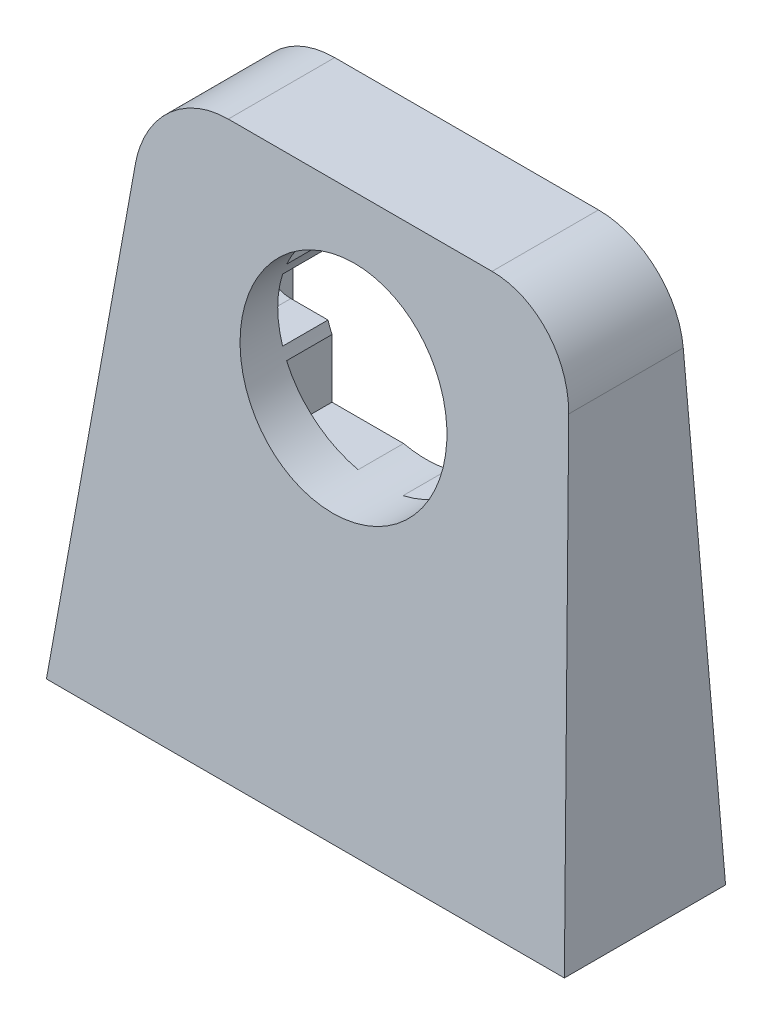
ISO-10303-21;
HEADER;
FILE_DESCRIPTION(('STEP AP214'),'2;1');
FILE_NAME('part.step','',(''),(''),'','','');
FILE_SCHEMA(('AUTOMOTIVE_DESIGN { 1 0 10303 214 1 1 1 1 }'));
ENDSEC;
DATA;
#1=APPLICATION_CONTEXT('core data for automotive mechanical design processes');
#2=APPLICATION_PROTOCOL_DEFINITION('international standard','automotive_design',2000,#1);
#3=PRODUCT_CONTEXT('',#1,'mechanical');
#4=PRODUCT('Part','Part','',(#3));
#5=PRODUCT_RELATED_PRODUCT_CATEGORY('part','',(#4));
#6=PRODUCT_DEFINITION_FORMATION('','',#4);
#7=PRODUCT_DEFINITION_CONTEXT('part definition',#1,'design');
#8=PRODUCT_DEFINITION('design','',#6,#7);
#9=PRODUCT_DEFINITION_SHAPE('','',#8);
#10=(LENGTH_UNIT() NAMED_UNIT(*) SI_UNIT(.MILLI.,.METRE.));
#11=(NAMED_UNIT(*) PLANE_ANGLE_UNIT() SI_UNIT($,.RADIAN.));
#12=(NAMED_UNIT(*) SI_UNIT($,.STERADIAN.) SOLID_ANGLE_UNIT());
#13=UNCERTAINTY_MEASURE_WITH_UNIT(LENGTH_MEASURE(1.E-05),#10,'distance_accuracy_value','');
#14=(GEOMETRIC_REPRESENTATION_CONTEXT(3) GLOBAL_UNCERTAINTY_ASSIGNED_CONTEXT((#13)) GLOBAL_UNIT_ASSIGNED_CONTEXT((#10,
#11,#12)) REPRESENTATION_CONTEXT('',''));
#15=CARTESIAN_POINT('',(0.,0.,0.));
#16=DIRECTION('',(0.,0.,1.));
#17=DIRECTION('',(1.,0.,0.));
#18=AXIS2_PLACEMENT_3D('',#15,#16,#17);
#19=CARTESIAN_POINT('',(0.,15.495,6.06));
#20=DIRECTION('',(0.,-1.,0.));
#21=DIRECTION('',(0.,0.,-1.));
#22=AXIS2_PLACEMENT_3D('',#19,#20,#21);
#23=PLANE('',#22);
#24=DIRECTION('',(0.,0.,-1.));
#25=VECTOR('',#24,1.);
#26=CARTESIAN_POINT('',(-1.5833114033569,15.495,11.3594275189556));
#27=LINE('',#26,#25);
#28=CARTESIAN_POINT('',(-1.5833114033569,15.495,6.06));
#29=VERTEX_POINT('',#28);
#30=CARTESIAN_POINT('',(-1.5833114033569,15.495,2.86));
#31=VERTEX_POINT('',#30);
#32=EDGE_CURVE('E552',#29,#31,#27,.T.);
#33=ORIENTED_EDGE('',*,*,#32,.F.);
#34=DIRECTION('',(-1.,0.,0.));
#35=VECTOR('',#34,1.);
#36=CARTESIAN_POINT('',(0.,15.495,6.06));
#37=LINE('',#36,#35);
#38=CARTESIAN_POINT('',(-6.625,15.495,6.06));
#39=VERTEX_POINT('',#38);
#40=EDGE_CURVE('E268',#29,#39,#37,.T.);
#41=ORIENTED_EDGE('',*,*,#40,.T.);
#42=DIRECTION('',(0.,0.,-1.));
#43=VECTOR('',#42,1.);
#44=CARTESIAN_POINT('',(-6.625,15.495,6.06));
#45=LINE('',#44,#43);
#46=CARTESIAN_POINT('',(-6.625,15.495,2.86));
#47=VERTEX_POINT('',#46);
#48=EDGE_CURVE('E317',#39,#47,#45,.T.);
#49=ORIENTED_EDGE('',*,*,#48,.T.);
#50=DIRECTION('',(-1.,0.,0.));
#51=VECTOR('',#50,1.);
#52=CARTESIAN_POINT('',(0.,15.495,2.86));
#53=LINE('',#52,#51);
#54=EDGE_CURVE('E307',#31,#47,#53,.T.);
#55=ORIENTED_EDGE('',*,*,#54,.F.);
#56=EDGE_LOOP('',(#33,#41,#49,#55));
#57=FACE_BOUND('',#56,.T.);
#58=ADVANCED_FACE('F40',(#57),#23,.T.);
#59=CARTESIAN_POINT('',(0.,1.345,6.06));
#60=DIRECTION('',(0.,-1.,0.));
#61=DIRECTION('',(0.,0.,-1.));
#62=AXIS2_PLACEMENT_3D('',#59,#60,#61);
#63=PLANE('',#62);
#64=DIRECTION('',(-1.,0.,0.));
#65=VECTOR('',#64,1.);
#66=CARTESIAN_POINT('',(0.,1.345,6.06));
#67=LINE('',#66,#65);
#68=CARTESIAN_POINT('',(-1.5833114033569,1.345,6.06));
#69=VERTEX_POINT('',#68);
#70=CARTESIAN_POINT('',(-6.625,1.345,6.06));
#71=VERTEX_POINT('',#70);
#72=EDGE_CURVE('E532',#69,#71,#67,.T.);
#73=ORIENTED_EDGE('',*,*,#72,.F.);
#74=DIRECTION('',(0.,0.,-1.));
#75=VECTOR('',#74,1.);
#76=CARTESIAN_POINT('',(-1.5833114033569,1.345,11.3594275189556));
#77=LINE('',#76,#75);
#78=CARTESIAN_POINT('',(-1.5833114033569,1.345,2.86));
#79=VERTEX_POINT('',#78);
#80=EDGE_CURVE('E556',#69,#79,#77,.T.);
#81=ORIENTED_EDGE('',*,*,#80,.T.);
#82=DIRECTION('',(-1.,0.,0.));
#83=VECTOR('',#82,1.);
#84=CARTESIAN_POINT('',(0.,1.345,2.86));
#85=LINE('',#84,#83);
#86=CARTESIAN_POINT('',(-6.625,1.345,2.86));
#87=VERTEX_POINT('',#86);
#88=EDGE_CURVE('E290',#79,#87,#85,.T.);
#89=ORIENTED_EDGE('',*,*,#88,.T.);
#90=DIRECTION('',(0.,0.,-1.));
#91=VECTOR('',#90,1.);
#92=CARTESIAN_POINT('',(-6.625,1.345,6.06));
#93=LINE('',#92,#91);
#94=EDGE_CURVE('E325',#71,#87,#93,.T.);
#95=ORIENTED_EDGE('',*,*,#94,.F.);
#96=EDGE_LOOP('',(#73,#81,#89,#95));
#97=FACE_BOUND('',#96,.T.);
#98=ADVANCED_FACE('F456',(#97),#63,.F.);
#99=CARTESIAN_POINT('',(0.,0.,6.06));
#100=DIRECTION('',(0.,0.,-1.));
#101=DIRECTION('',(-1.,0.,0.));
#102=AXIS2_PLACEMENT_3D('',#99,#100,#101);
#103=PLANE('',#102);
#104=CARTESIAN_POINT('',(0.,8.42,6.06));
#105=DIRECTION('',(0.,0.,-1.));
#106=DIRECTION('',(-1.,0.,0.));
#107=AXIS2_PLACEMENT_3D('',#104,#105,#106);
#108=CIRCLE('',#107,7.25);
#109=CARTESIAN_POINT('',(-6.625,11.3648047473474,6.06));
#110=VERTEX_POINT('',#109);
#111=EDGE_CURVE('E510',#110,#29,#108,.T.);
#112=ORIENTED_EDGE('',*,*,#111,.F.);
#113=DIRECTION('',(0.,-1.,0.));
#114=VECTOR('',#113,1.);
#115=CARTESIAN_POINT('',(-6.625,0.,6.06));
#116=LINE('',#115,#114);
#117=EDGE_CURVE('E265',#39,#110,#116,.T.);
#118=ORIENTED_EDGE('',*,*,#117,.F.);
#119=ORIENTED_EDGE('',*,*,#40,.F.);
#120=EDGE_LOOP('',(#112,#118,#119));
#121=FACE_BOUND('',#120,.T.);
#122=ADVANCED_FACE('F463',(#121),#103,.T.);
#123=CARTESIAN_POINT('',(1.5833114033569,15.495,6.06));
#124=VERTEX_POINT('',#123);
#125=CARTESIAN_POINT('',(6.625,11.3648047473474,6.06));
#126=VERTEX_POINT('',#125);
#127=EDGE_CURVE('E506',#124,#126,#108,.T.);
#128=ORIENTED_EDGE('',*,*,#127,.F.);
#129=CARTESIAN_POINT('',(6.625,15.495,6.06));
#130=VERTEX_POINT('',#129);
#131=EDGE_CURVE('E275',#130,#124,#37,.T.);
#132=ORIENTED_EDGE('',*,*,#131,.F.);
#133=DIRECTION('',(0.,-1.,0.));
#134=VECTOR('',#133,1.);
#135=CARTESIAN_POINT('',(6.625,0.,6.06));
#136=LINE('',#135,#134);
#137=EDGE_CURVE('E278',#130,#126,#136,.T.);
#138=ORIENTED_EDGE('',*,*,#137,.T.);
#139=EDGE_LOOP('',(#128,#132,#138));
#140=FACE_BOUND('',#139,.T.);
#141=ADVANCED_FACE('F505',(#140),#103,.T.);
#142=CARTESIAN_POINT('',(6.90814736380167,10.62,6.06));
#143=VERTEX_POINT('',#142);
#144=CARTESIAN_POINT('',(6.90814736380167,6.22,6.06));
#145=VERTEX_POINT('',#144);
#146=EDGE_CURVE('E250',#143,#145,#108,.T.);
#147=ORIENTED_EDGE('',*,*,#146,.F.);
#148=DIRECTION('',(1.,0.,0.));
#149=VECTOR('',#148,1.);
#150=CARTESIAN_POINT('',(0.,10.62,6.06));
#151=LINE('',#150,#149);
#152=CARTESIAN_POINT('',(9.525,10.62,6.06));
#153=VERTEX_POINT('',#152);
#154=EDGE_CURVE('E279',#143,#153,#151,.T.);
#155=ORIENTED_EDGE('',*,*,#154,.T.);
#156=CARTESIAN_POINT('',(9.525,8.42,6.06));
#157=DIRECTION('',(0.,0.,-1.));
#158=DIRECTION('',(-1.,0.,0.));
#159=AXIS2_PLACEMENT_3D('',#156,#157,#158);
#160=CIRCLE('',#159,2.2);
#161=CARTESIAN_POINT('',(9.525,6.22,6.06));
#162=VERTEX_POINT('',#161);
#163=EDGE_CURVE('E310',#162,#153,#160,.F.);
#164=ORIENTED_EDGE('',*,*,#163,.F.);
#165=DIRECTION('',(1.,0.,0.));
#166=VECTOR('',#165,1.);
#167=CARTESIAN_POINT('',(0.,6.22,6.06));
#168=LINE('',#167,#166);
#169=EDGE_CURVE('E528',#145,#162,#168,.T.);
#170=ORIENTED_EDGE('',*,*,#169,.F.);
#171=EDGE_LOOP('',(#147,#155,#164,#170));
#172=FACE_BOUND('',#171,.T.);
#173=ADVANCED_FACE('F565',(#172),#103,.T.);
#174=CARTESIAN_POINT('',(6.625,5.47519525265257,6.06));
#175=VERTEX_POINT('',#174);
#176=CARTESIAN_POINT('',(1.5833114033569,1.345,6.06));
#177=VERTEX_POINT('',#176);
#178=EDGE_CURVE('E489',#175,#177,#108,.T.);
#179=ORIENTED_EDGE('',*,*,#178,.F.);
#180=CARTESIAN_POINT('',(6.625,1.345,6.06));
#181=VERTEX_POINT('',#180);
#182=EDGE_CURVE('E530',#175,#181,#136,.T.);
#183=ORIENTED_EDGE('',*,*,#182,.T.);
#184=EDGE_CURVE('E533',#181,#177,#67,.T.);
#185=ORIENTED_EDGE('',*,*,#184,.T.);
#186=EDGE_LOOP('',(#179,#183,#185));
#187=FACE_BOUND('',#186,.T.);
#188=ADVANCED_FACE('F448',(#187),#103,.T.);
#189=CARTESIAN_POINT('',(-6.625,5.47519525265257,6.06));
#190=VERTEX_POINT('',#189);
#191=EDGE_CURVE('E251',#69,#190,#108,.T.);
#192=ORIENTED_EDGE('',*,*,#191,.F.);
#193=ORIENTED_EDGE('',*,*,#72,.T.);
#194=EDGE_CURVE('E270',#190,#71,#116,.T.);
#195=ORIENTED_EDGE('',*,*,#194,.F.);
#196=EDGE_LOOP('',(#192,#193,#195));
#197=FACE_BOUND('',#196,.T.);
#198=ADVANCED_FACE('F440',(#197),#103,.T.);
#199=CARTESIAN_POINT('',(0.,0.,2.86));
#200=DIRECTION('',(0.,0.,-1.));
#201=DIRECTION('',(-1.,0.,0.));
#202=AXIS2_PLACEMENT_3D('',#199,#200,#201);
#203=PLANE('',#202);
#204=CARTESIAN_POINT('',(10.2,14.86,2.86));
#205=DIRECTION('',(0.,0.,-1.));
#206=DIRECTION('',(-1.,0.,0.));
#207=AXIS2_PLACEMENT_3D('',#204,#205,#206);
#208=CIRCLE('',#207,1.475);
#209=CARTESIAN_POINT('',(8.725,14.86,2.86));
#210=VERTEX_POINT('',#209);
#211=EDGE_CURVE('E635',#210,#210,#208,.T.);
#212=ORIENTED_EDGE('',*,*,#211,.F.);
#213=EDGE_LOOP('',(#212));
#214=FACE_BOUND('',#213,.T.);
#215=CARTESIAN_POINT('',(-10.2,14.86,2.86));
#216=DIRECTION('',(0.,0.,-1.));
#217=DIRECTION('',(1.,0.,0.));
#218=AXIS2_PLACEMENT_3D('',#215,#216,#217);
#219=CIRCLE('',#218,1.475);
#220=CARTESIAN_POINT('',(-8.725,14.86,2.86));
#221=VERTEX_POINT('',#220);
#222=EDGE_CURVE('E642',#221,#221,#219,.T.);
#223=ORIENTED_EDGE('',*,*,#222,.F.);
#224=EDGE_LOOP('',(#223));
#225=FACE_BOUND('',#224,.T.);
#226=CARTESIAN_POINT('',(0.,8.42,2.86));
#227=DIRECTION('',(0.,0.,-1.));
#228=DIRECTION('',(-1.,0.,0.));
#229=AXIS2_PLACEMENT_3D('',#226,#227,#228);
#230=CIRCLE('',#229,7.25);
#231=CARTESIAN_POINT('',(-6.90814736380167,10.62,2.86));
#232=VERTEX_POINT('',#231);
#233=CARTESIAN_POINT('',(-6.625,11.3648047473474,2.86));
#234=VERTEX_POINT('',#233);
#235=EDGE_CURVE('E544',#232,#234,#230,.T.);
#236=ORIENTED_EDGE('',*,*,#235,.F.);
#237=DIRECTION('',(-1.,0.,0.));
#238=VECTOR('',#237,1.);
#239=CARTESIAN_POINT('',(0.,10.62,2.86));
#240=LINE('',#239,#238);
#241=CARTESIAN_POINT('',(-9.525,10.62,2.86));
#242=VERTEX_POINT('',#241);
#243=EDGE_CURVE('E258',#232,#242,#240,.T.);
#244=ORIENTED_EDGE('',*,*,#243,.T.);
#245=CARTESIAN_POINT('',(-9.525,8.42,2.86));
#246=DIRECTION('',(0.,0.,-1.));
#247=DIRECTION('',(-1.,0.,0.));
#248=AXIS2_PLACEMENT_3D('',#245,#246,#247);
#249=CIRCLE('',#248,2.2);
#250=CARTESIAN_POINT('',(-9.525,6.22,2.86));
#251=VERTEX_POINT('',#250);
#252=EDGE_CURVE('E300',#251,#242,#249,.T.);
#253=ORIENTED_EDGE('',*,*,#252,.F.);
#254=DIRECTION('',(-1.,0.,0.));
#255=VECTOR('',#254,1.);
#256=CARTESIAN_POINT('',(0.,6.22,2.86));
#257=LINE('',#256,#255);
#258=CARTESIAN_POINT('',(-6.90814736380167,6.22,2.86));
#259=VERTEX_POINT('',#258);
#260=EDGE_CURVE('E297',#259,#251,#257,.T.);
#261=ORIENTED_EDGE('',*,*,#260,.F.);
#262=CARTESIAN_POINT('',(-6.625,5.47519525265257,2.86));
#263=VERTEX_POINT('',#262);
#264=EDGE_CURVE('E259',#263,#259,#230,.T.);
#265=ORIENTED_EDGE('',*,*,#264,.F.);
#266=DIRECTION('',(0.,-1.,0.));
#267=VECTOR('',#266,1.);
#268=CARTESIAN_POINT('',(-6.625,0.,2.86));
#269=LINE('',#268,#267);
#270=EDGE_CURVE('E295',#263,#87,#269,.T.);
#271=ORIENTED_EDGE('',*,*,#270,.T.);
#272=ORIENTED_EDGE('',*,*,#88,.F.);
#273=CARTESIAN_POINT('',(1.5833114033569,1.345,2.86));
#274=VERTEX_POINT('',#273);
#275=EDGE_CURVE('E549',#274,#79,#230,.T.);
#276=ORIENTED_EDGE('',*,*,#275,.F.);
#277=CARTESIAN_POINT('',(6.625,1.345,2.86));
#278=VERTEX_POINT('',#277);
#279=EDGE_CURVE('E292',#278,#274,#85,.T.);
#280=ORIENTED_EDGE('',*,*,#279,.F.);
#281=DIRECTION('',(0.,-1.,0.));
#282=VECTOR('',#281,1.);
#283=CARTESIAN_POINT('',(6.625,0.,2.86));
#284=LINE('',#283,#282);
#285=CARTESIAN_POINT('',(6.625,5.47519525265257,2.86));
#286=VERTEX_POINT('',#285);
#287=EDGE_CURVE('E288',#286,#278,#284,.T.);
#288=ORIENTED_EDGE('',*,*,#287,.F.);
#289=CARTESIAN_POINT('',(6.90814736380167,6.22,2.86));
#290=VERTEX_POINT('',#289);
#291=EDGE_CURVE('E555',#290,#286,#230,.T.);
#292=ORIENTED_EDGE('',*,*,#291,.F.);
#293=DIRECTION('',(1.,0.,0.));
#294=VECTOR('',#293,1.);
#295=CARTESIAN_POINT('',(0.,6.22,2.86));
#296=LINE('',#295,#294);
#297=CARTESIAN_POINT('',(9.525,6.22,2.86));
#298=VERTEX_POINT('',#297);
#299=EDGE_CURVE('E285',#290,#298,#296,.T.);
#300=ORIENTED_EDGE('',*,*,#299,.T.);
#301=CARTESIAN_POINT('',(9.525,8.42,2.86));
#302=DIRECTION('',(0.,0.,-1.));
#303=DIRECTION('',(-1.,0.,0.));
#304=AXIS2_PLACEMENT_3D('',#301,#302,#303);
#305=CIRCLE('',#304,2.2);
#306=CARTESIAN_POINT('',(9.525,10.62,2.86));
#307=VERTEX_POINT('',#306);
#308=EDGE_CURVE('E282',#298,#307,#305,.F.);
#309=ORIENTED_EDGE('',*,*,#308,.T.);
#310=DIRECTION('',(1.,0.,0.));
#311=VECTOR('',#310,1.);
#312=CARTESIAN_POINT('',(0.,10.62,2.86));
#313=LINE('',#312,#311);
#314=CARTESIAN_POINT('',(6.90814736380167,10.62,2.86));
#315=VERTEX_POINT('',#314);
#316=EDGE_CURVE('E308',#315,#307,#313,.T.);
#317=ORIENTED_EDGE('',*,*,#316,.F.);
#318=CARTESIAN_POINT('',(6.625,11.3648047473474,2.86));
#319=VERTEX_POINT('',#318);
#320=EDGE_CURVE('E499',#319,#315,#230,.T.);
#321=ORIENTED_EDGE('',*,*,#320,.F.);
#322=CARTESIAN_POINT('',(6.625,15.495,2.86));
#323=VERTEX_POINT('',#322);
#324=EDGE_CURVE('E291',#323,#319,#284,.T.);
#325=ORIENTED_EDGE('',*,*,#324,.F.);
#326=CARTESIAN_POINT('',(1.5833114033569,15.495,2.86));
#327=VERTEX_POINT('',#326);
#328=EDGE_CURVE('E304',#323,#327,#53,.T.);
#329=ORIENTED_EDGE('',*,*,#328,.T.);
#330=EDGE_CURVE('E494',#31,#327,#230,.T.);
#331=ORIENTED_EDGE('',*,*,#330,.F.);
#332=ORIENTED_EDGE('',*,*,#54,.T.);
#333=EDGE_CURVE('E298',#47,#234,#269,.T.);
#334=ORIENTED_EDGE('',*,*,#333,.T.);
#335=EDGE_LOOP('',(#236,#244,#253,#261,#265,#271,#272,#276,#280,#288,#292,#300,#309,#317,#321,
#325,#329,#331,#332,#334));
#336=FACE_BOUND('',#335,.T.);
#337=DIRECTION('',(0.,1.,0.));
#338=VECTOR('',#337,1.);
#339=CARTESIAN_POINT('',(-12.25,17.11,2.86));
#340=LINE('',#339,#338);
#341=CARTESIAN_POINT('',(-12.25,-17.11,2.86));
#342=VERTEX_POINT('',#341);
#343=CARTESIAN_POINT('',(-12.25,17.11,2.86));
#344=VERTEX_POINT('',#343);
#345=EDGE_CURVE('E333',#342,#344,#340,.T.);
#346=ORIENTED_EDGE('',*,*,#345,.T.);
#347=DIRECTION('',(1.,0.,0.));
#348=VECTOR('',#347,1.);
#349=CARTESIAN_POINT('',(12.25,17.11,2.86));
#350=LINE('',#349,#348);
#351=CARTESIAN_POINT('',(12.25,17.11,2.86));
#352=VERTEX_POINT('',#351);
#353=EDGE_CURVE('E336',#344,#352,#350,.T.);
#354=ORIENTED_EDGE('',*,*,#353,.T.);
#355=DIRECTION('',(0.,-1.,0.));
#356=VECTOR('',#355,1.);
#357=CARTESIAN_POINT('',(12.25,17.11,2.86));
#358=LINE('',#357,#356);
#359=CARTESIAN_POINT('',(12.25,-17.11,2.86));
#360=VERTEX_POINT('',#359);
#361=EDGE_CURVE('E340',#352,#360,#358,.T.);
#362=ORIENTED_EDGE('',*,*,#361,.T.);
#363=DIRECTION('',(-1.,0.,0.));
#364=VECTOR('',#363,1.);
#365=CARTESIAN_POINT('',(12.25,-17.11,2.86));
#366=LINE('',#365,#364);
#367=EDGE_CURVE('E343',#360,#342,#366,.T.);
#368=ORIENTED_EDGE('',*,*,#367,.T.);
#369=EDGE_LOOP('',(#346,#354,#362,#368));
#370=FACE_BOUND('',#369,.T.);
#371=ADVANCED_FACE('F438',(#214,#225,#336,#370),#203,.T.);
#372=CARTESIAN_POINT('',(0.,-17.11,7.5));
#373=DIRECTION('',(0.,1.,0.));
#374=DIRECTION('',(0.,0.,1.));
#375=AXIS2_PLACEMENT_3D('',#372,#373,#374);
#376=PLANE('',#375);
#377=DIRECTION('',(1.,0.,0.));
#378=VECTOR('',#377,1.);
#379=CARTESIAN_POINT('',(0.,-17.11,0.));
#380=LINE('',#379,#378);
#381=CARTESIAN_POINT('',(-18.25,-17.11,0.));
#382=VERTEX_POINT('',#381);
#383=CARTESIAN_POINT('',(-12.25,-17.11,0.));
#384=VERTEX_POINT('',#383);
#385=EDGE_CURVE('E366',#382,#384,#380,.T.);
#386=ORIENTED_EDGE('',*,*,#385,.T.);
#387=DIRECTION('',(0.,0.,-1.));
#388=VECTOR('',#387,1.);
#389=CARTESIAN_POINT('',(-12.25,-17.11,2.86));
#390=LINE('',#389,#388);
#391=EDGE_CURVE('E352',#342,#384,#390,.T.);
#392=ORIENTED_EDGE('',*,*,#391,.F.);
#393=ORIENTED_EDGE('',*,*,#367,.F.);
#394=DIRECTION('',(0.,0.,-1.));
#395=VECTOR('',#394,1.);
#396=CARTESIAN_POINT('',(12.25,-17.11,2.86));
#397=LINE('',#396,#395);
#398=CARTESIAN_POINT('',(12.25,-17.11,0.));
#399=VERTEX_POINT('',#398);
#400=EDGE_CURVE('E355',#360,#399,#397,.T.);
#401=ORIENTED_EDGE('',*,*,#400,.T.);
#402=CARTESIAN_POINT('',(18.25,-17.11,0.));
#403=VERTEX_POINT('',#402);
#404=EDGE_CURVE('E354',#399,#403,#380,.T.);
#405=ORIENTED_EDGE('',*,*,#404,.T.);
#406=DIRECTION('',(0.,0.,-1.));
#407=VECTOR('',#406,1.);
#408=CARTESIAN_POINT('',(18.25,-17.11,7.5));
#409=LINE('',#408,#407);
#410=CARTESIAN_POINT('',(18.25,-17.11,11.3594275189556));
#411=VERTEX_POINT('',#410);
#412=EDGE_CURVE('E377',#411,#403,#409,.T.);
#413=ORIENTED_EDGE('',*,*,#412,.F.);
#414=DIRECTION('',(1.,0.,0.));
#415=VECTOR('',#414,1.);
#416=CARTESIAN_POINT('',(-18.25,-17.11,11.3594275189556));
#417=LINE('',#416,#415);
#418=CARTESIAN_POINT('',(-18.25,-17.11,11.3594275189556));
#419=VERTEX_POINT('',#418);
#420=EDGE_CURVE('E408',#419,#411,#417,.T.);
#421=ORIENTED_EDGE('',*,*,#420,.F.);
#422=DIRECTION('',(0.,0.,-1.));
#423=VECTOR('',#422,1.);
#424=CARTESIAN_POINT('',(-18.25,-17.11,7.5));
#425=LINE('',#424,#423);
#426=EDGE_CURVE('E364',#419,#382,#425,.T.);
#427=ORIENTED_EDGE('',*,*,#426,.T.);
#428=EDGE_LOOP('',(#386,#392,#393,#401,#405,#413,#421,#427));
#429=FACE_BOUND('',#428,.T.);
#430=ADVANCED_FACE('F423',(#429),#376,.F.);
#431=CARTESIAN_POINT('',(16.4695173129903,1.56980693342773,7.5));
#432=DIRECTION('',(0.995488159006859,0.0948858539358391,0.));
#433=DIRECTION('',(-0.0948858539358392,0.99548815900686,0.));
#434=AXIS2_PLACEMENT_3D('',#431,#432,#433);
#435=PLANE('',#434);
#436=DIRECTION('',(0.0948858539358391,-0.99548815900686,0.));
#437=VECTOR('',#436,1.);
#438=CARTESIAN_POINT('',(16.4695173129903,1.56980693342773,0.));
#439=LINE('',#438,#437);
#440=CARTESIAN_POINT('',(15.267630639089,14.179315123615,0.));
#441=VERTEX_POINT('',#440);
#442=EDGE_CURVE('E369',#441,#403,#439,.T.);
#443=ORIENTED_EDGE('',*,*,#442,.F.);
#444=DIRECTION('',(0.,0.,-1.));
#445=VECTOR('',#444,1.);
#446=CARTESIAN_POINT('',(15.267630639089,14.179315123615,7.5));
#447=LINE('',#446,#445);
#448=CARTESIAN_POINT('',(15.267630639089,14.179315123615,8.07078798090132));
#449=VERTEX_POINT('',#448);
#450=EDGE_CURVE('E11',#441,#449,#447,.F.);
#451=ORIENTED_EDGE('',*,*,#450,.T.);
#452=DIRECTION('',(-0.0943707011374767,0.990083470219468,-0.104061965986605));
#453=VECTOR('',#452,1.);
#454=CARTESIAN_POINT('',(18.7408970137385,-22.2602109555653,11.9007365028972));
#455=LINE('',#454,#453);
#456=EDGE_CURVE('E286',#411,#449,#455,.T.);
#457=ORIENTED_EDGE('',*,*,#456,.F.);
#458=ORIENTED_EDGE('',*,*,#412,.T.);
#459=EDGE_LOOP('',(#443,#451,#457,#458));
#460=FACE_BOUND('',#459,.T.);
#461=ADVANCED_FACE('F421',(#460),#435,.T.);
#462=CARTESIAN_POINT('',(0.,19.61,7.5));
#463=DIRECTION('',(0.,1.,0.));
#464=DIRECTION('',(0.,0.,1.));
#465=AXIS2_PLACEMENT_3D('',#462,#463,#464);
#466=PLANE('',#465);
#467=DIRECTION('',(1.,0.,0.));
#468=VECTOR('',#467,1.);
#469=CARTESIAN_POINT('',(0.,19.61,0.));
#470=LINE('',#469,#468);
#471=CARTESIAN_POINT('',(-9.29470168504782,19.61,0.));
#472=VERTEX_POINT('',#471);
#473=CARTESIAN_POINT('',(9.29470168504783,19.61,0.));
#474=VERTEX_POINT('',#473);
#475=EDGE_CURVE('E371',#472,#474,#470,.T.);
#476=ORIENTED_EDGE('',*,*,#475,.F.);
#477=DIRECTION('',(0.,0.,-1.));
#478=VECTOR('',#477,1.);
#479=CARTESIAN_POINT('',(-9.29470168504782,19.61,7.5));
#480=LINE('',#479,#478);
#481=CARTESIAN_POINT('',(-9.29470168504782,19.61,7.5));
#482=VERTEX_POINT('',#481);
#483=EDGE_CURVE('E393',#472,#482,#480,.F.);
#484=ORIENTED_EDGE('',*,*,#483,.T.);
#485=DIRECTION('',(1.,0.,0.));
#486=VECTOR('',#485,1.);
#487=CARTESIAN_POINT('',(0.,19.61,7.5));
#488=LINE('',#487,#486);
#489=CARTESIAN_POINT('',(9.29470168504783,19.61,7.5));
#490=VERTEX_POINT('',#489);
#491=EDGE_CURVE('E362',#482,#490,#488,.T.);
#492=ORIENTED_EDGE('',*,*,#491,.T.);
#493=DIRECTION('',(0.,0.,-1.));
#494=VECTOR('',#493,1.);
#495=CARTESIAN_POINT('',(9.29470168504783,19.61,7.5));
#496=LINE('',#495,#494);
#497=EDGE_CURVE('E390',#490,#474,#496,.T.);
#498=ORIENTED_EDGE('',*,*,#497,.T.);
#499=EDGE_LOOP('',(#476,#484,#492,#498));
#500=FACE_BOUND('',#499,.T.);
#501=ADVANCED_FACE('F416',(#500),#466,.T.);
#502=CARTESIAN_POINT('',(-16.4695173129903,1.56980693342772,7.5));
#503=DIRECTION('',(-0.995488159006859,0.0948858539358389,0.));
#504=DIRECTION('',(-0.0948858539358389,-0.99548815900686,0.));
#505=AXIS2_PLACEMENT_3D('',#502,#503,#504);
#506=PLANE('',#505);
#507=DIRECTION('',(-0.0943707011374763,-0.990083470219468,0.104061965986605));
#508=VECTOR('',#507,1.);
#509=CARTESIAN_POINT('',(-15.278798138416,14.062152102104,8.08310231067865));
#510=LINE('',#509,#508);
#511=CARTESIAN_POINT('',(-15.267630639089,14.179315123615,8.07078798090132));
#512=VERTEX_POINT('',#511);
#513=EDGE_CURVE('E399',#512,#419,#510,.T.);
#514=ORIENTED_EDGE('',*,*,#513,.F.);
#515=DIRECTION('',(0.,0.,-1.));
#516=VECTOR('',#515,1.);
#517=CARTESIAN_POINT('',(-15.267630639089,14.179315123615,7.5));
#518=LINE('',#517,#516);
#519=CARTESIAN_POINT('',(-15.267630639089,14.179315123615,0.));
#520=VERTEX_POINT('',#519);
#521=EDGE_CURVE('E380',#512,#520,#518,.T.);
#522=ORIENTED_EDGE('',*,*,#521,.T.);
#523=DIRECTION('',(0.0948858539358389,0.99548815900686,0.));
#524=VECTOR('',#523,1.);
#525=CARTESIAN_POINT('',(-16.4695173129903,1.56980693342772,0.));
#526=LINE('',#525,#524);
#527=EDGE_CURVE('E365',#382,#520,#526,.T.);
#528=ORIENTED_EDGE('',*,*,#527,.F.);
#529=ORIENTED_EDGE('',*,*,#426,.F.);
#530=EDGE_LOOP('',(#514,#522,#528,#529));
#531=FACE_BOUND('',#530,.T.);
#532=ADVANCED_FACE('F405',(#531),#506,.T.);
#533=CARTESIAN_POINT('',(0.,0.,0.));
#534=DIRECTION('',(0.,0.,1.));
#535=DIRECTION('',(1.,0.,0.));
#536=AXIS2_PLACEMENT_3D('',#533,#534,#535);
#537=PLANE('',#536);
#538=ORIENTED_EDGE('',*,*,#527,.T.);
#539=CARTESIAN_POINT('',(-9.29470168504782,13.61,0.));
#540=DIRECTION('',(0.,0.,1.));
#541=DIRECTION('',(1.,0.,0.));
#542=AXIS2_PLACEMENT_3D('',#539,#540,#541);
#543=CIRCLE('',#542,6.);
#544=EDGE_CURVE('E388',#520,#472,#543,.F.);
#545=ORIENTED_EDGE('',*,*,#544,.T.);
#546=ORIENTED_EDGE('',*,*,#475,.T.);
#547=CARTESIAN_POINT('',(9.29470168504783,13.61,0.));
#548=DIRECTION('',(0.,0.,1.));
#549=DIRECTION('',(1.,0.,0.));
#550=AXIS2_PLACEMENT_3D('',#547,#548,#549);
#551=CIRCLE('',#550,6.);
#552=EDGE_CURVE('E386',#474,#441,#551,.F.);
#553=ORIENTED_EDGE('',*,*,#552,.T.);
#554=ORIENTED_EDGE('',*,*,#442,.T.);
#555=ORIENTED_EDGE('',*,*,#404,.F.);
#556=DIRECTION('',(0.,-1.,0.));
#557=VECTOR('',#556,1.);
#558=CARTESIAN_POINT('',(12.25,17.11,0.));
#559=LINE('',#558,#557);
#560=CARTESIAN_POINT('',(12.25,17.11,0.));
#561=VERTEX_POINT('',#560);
#562=EDGE_CURVE('E337',#561,#399,#559,.T.);
#563=ORIENTED_EDGE('',*,*,#562,.F.);
#564=DIRECTION('',(1.,0.,0.));
#565=VECTOR('',#564,1.);
#566=CARTESIAN_POINT('',(12.25,17.11,0.));
#567=LINE('',#566,#565);
#568=CARTESIAN_POINT('',(-12.25,17.11,0.));
#569=VERTEX_POINT('',#568);
#570=EDGE_CURVE('E348',#569,#561,#567,.T.);
#571=ORIENTED_EDGE('',*,*,#570,.F.);
#572=DIRECTION('',(0.,1.,0.));
#573=VECTOR('',#572,1.);
#574=CARTESIAN_POINT('',(-12.25,17.11,0.));
#575=LINE('',#574,#573);
#576=EDGE_CURVE('E314',#384,#569,#575,.T.);
#577=ORIENTED_EDGE('',*,*,#576,.F.);
#578=ORIENTED_EDGE('',*,*,#385,.F.);
#579=EDGE_LOOP('',(#538,#545,#546,#553,#554,#555,#563,#571,#577,#578));
#580=FACE_BOUND('',#579,.T.);
#581=ADVANCED_FACE('F413',(#580),#537,.F.);
#582=CARTESIAN_POINT('',(-12.25,17.11,2.86));
#583=DIRECTION('',(-1.,0.,0.));
#584=DIRECTION('',(0.,-1.,0.));
#585=AXIS2_PLACEMENT_3D('',#582,#583,#584);
#586=PLANE('',#585);
#587=ORIENTED_EDGE('',*,*,#576,.T.);
#588=DIRECTION('',(0.,0.,-1.));
#589=VECTOR('',#588,1.);
#590=CARTESIAN_POINT('',(-12.25,17.11,2.86));
#591=LINE('',#590,#589);
#592=EDGE_CURVE('E346',#344,#569,#591,.T.);
#593=ORIENTED_EDGE('',*,*,#592,.F.);
#594=ORIENTED_EDGE('',*,*,#345,.F.);
#595=ORIENTED_EDGE('',*,*,#391,.T.);
#596=EDGE_LOOP('',(#587,#593,#594,#595));
#597=FACE_BOUND('',#596,.T.);
#598=ADVANCED_FACE('F435',(#597),#586,.F.);
#599=CARTESIAN_POINT('',(12.25,17.11,2.86));
#600=DIRECTION('',(1.,0.,0.));
#601=DIRECTION('',(0.,1.,0.));
#602=AXIS2_PLACEMENT_3D('',#599,#600,#601);
#603=PLANE('',#602);
#604=ORIENTED_EDGE('',*,*,#562,.T.);
#605=ORIENTED_EDGE('',*,*,#400,.F.);
#606=ORIENTED_EDGE('',*,*,#361,.F.);
#607=DIRECTION('',(0.,0.,-1.));
#608=VECTOR('',#607,1.);
#609=CARTESIAN_POINT('',(12.25,17.11,2.86));
#610=LINE('',#609,#608);
#611=EDGE_CURVE('E358',#352,#561,#610,.T.);
#612=ORIENTED_EDGE('',*,*,#611,.T.);
#613=EDGE_LOOP('',(#604,#605,#606,#612));
#614=FACE_BOUND('',#613,.T.);
#615=ADVANCED_FACE('F429',(#614),#603,.F.);
#616=CARTESIAN_POINT('',(12.25,17.11,2.86));
#617=DIRECTION('',(0.,1.,0.));
#618=DIRECTION('',(0.,0.,1.));
#619=AXIS2_PLACEMENT_3D('',#616,#617,#618);
#620=PLANE('',#619);
#621=ORIENTED_EDGE('',*,*,#570,.T.);
#622=ORIENTED_EDGE('',*,*,#611,.F.);
#623=ORIENTED_EDGE('',*,*,#353,.F.);
#624=ORIENTED_EDGE('',*,*,#592,.T.);
#625=EDGE_LOOP('',(#621,#622,#623,#624));
#626=FACE_BOUND('',#625,.T.);
#627=ADVANCED_FACE('F433',(#626),#620,.F.);
#628=CARTESIAN_POINT('',(9.525,8.42,6.06));
#629=DIRECTION('',(0.,0.,-1.));
#630=DIRECTION('',(-1.,0.,0.));
#631=AXIS2_PLACEMENT_3D('',#628,#629,#630);
#632=CYLINDRICAL_SURFACE('',#631,2.2);
#633=ORIENTED_EDGE('',*,*,#308,.F.);
#634=DIRECTION('',(0.,0.,-1.));
#635=VECTOR('',#634,1.);
#636=CARTESIAN_POINT('',(9.525,6.22,6.06));
#637=LINE('',#636,#635);
#638=EDGE_CURVE('E281',#162,#298,#637,.T.);
#639=ORIENTED_EDGE('',*,*,#638,.F.);
#640=ORIENTED_EDGE('',*,*,#163,.T.);
#641=DIRECTION('',(0.,0.,-1.));
#642=VECTOR('',#641,1.);
#643=CARTESIAN_POINT('',(9.525,10.62,6.06));
#644=LINE('',#643,#642);
#645=EDGE_CURVE('E311',#153,#307,#644,.T.);
#646=ORIENTED_EDGE('',*,*,#645,.T.);
#647=EDGE_LOOP('',(#633,#639,#640,#646));
#648=FACE_BOUND('',#647,.T.);
#649=ADVANCED_FACE('F570',(#648),#632,.F.);
#650=CARTESIAN_POINT('',(0.,10.62,6.06));
#651=DIRECTION('',(0.,1.,0.));
#652=DIRECTION('',(0.,0.,1.));
#653=AXIS2_PLACEMENT_3D('',#650,#651,#652);
#654=PLANE('',#653);
#655=ORIENTED_EDGE('',*,*,#154,.F.);
#656=DIRECTION('',(0.,0.,-1.));
#657=VECTOR('',#656,1.);
#658=CARTESIAN_POINT('',(6.90814736380167,10.62,11.3594275189556));
#659=LINE('',#658,#657);
#660=EDGE_CURVE('E513',#143,#315,#659,.T.);
#661=ORIENTED_EDGE('',*,*,#660,.T.);
#662=ORIENTED_EDGE('',*,*,#316,.T.);
#663=ORIENTED_EDGE('',*,*,#645,.F.);
#664=EDGE_LOOP('',(#655,#661,#662,#663));
#665=FACE_BOUND('',#664,.T.);
#666=ADVANCED_FACE('F480',(#665),#654,.F.);
#667=CARTESIAN_POINT('',(6.625,0.,6.06));
#668=DIRECTION('',(1.,0.,0.));
#669=DIRECTION('',(0.,1.,0.));
#670=AXIS2_PLACEMENT_3D('',#667,#668,#669);
#671=PLANE('',#670);
#672=ORIENTED_EDGE('',*,*,#324,.T.);
#673=DIRECTION('',(0.,0.,-1.));
#674=VECTOR('',#673,1.);
#675=CARTESIAN_POINT('',(6.625,11.3648047473474,11.3594275189556));
#676=LINE('',#675,#674);
#677=EDGE_CURVE('E502',#319,#126,#676,.F.);
#678=ORIENTED_EDGE('',*,*,#677,.T.);
#679=ORIENTED_EDGE('',*,*,#137,.F.);
#680=DIRECTION('',(0.,0.,-1.));
#681=VECTOR('',#680,1.);
#682=CARTESIAN_POINT('',(6.625,15.495,6.06));
#683=LINE('',#682,#681);
#684=EDGE_CURVE('E315',#130,#323,#683,.T.);
#685=ORIENTED_EDGE('',*,*,#684,.T.);
#686=EDGE_LOOP('',(#672,#678,#679,#685));
#687=FACE_BOUND('',#686,.T.);
#688=ADVANCED_FACE('F472',(#687),#671,.F.);
#689=DIRECTION('',(0.,0.,-1.));
#690=VECTOR('',#689,1.);
#691=CARTESIAN_POINT('',(1.5833114033569,15.495,11.3594275189556));
#692=LINE('',#691,#690);
#693=EDGE_CURVE('E485',#327,#124,#692,.F.);
#694=ORIENTED_EDGE('',*,*,#693,.F.);
#695=ORIENTED_EDGE('',*,*,#328,.F.);
#696=ORIENTED_EDGE('',*,*,#684,.F.);
#697=ORIENTED_EDGE('',*,*,#131,.T.);
#698=EDGE_LOOP('',(#694,#695,#696,#697));
#699=FACE_BOUND('',#698,.T.);
#700=ADVANCED_FACE('F459',(#699),#23,.T.);
#701=CARTESIAN_POINT('',(-6.625,0.,6.06));
#702=DIRECTION('',(1.,0.,0.));
#703=DIRECTION('',(0.,1.,0.));
#704=AXIS2_PLACEMENT_3D('',#701,#702,#703);
#705=PLANE('',#704);
#706=DIRECTION('',(0.,0.,-1.));
#707=VECTOR('',#706,1.);
#708=CARTESIAN_POINT('',(-6.625,11.3648047473474,11.3594275189556));
#709=LINE('',#708,#707);
#710=EDGE_CURVE('E550',#234,#110,#709,.F.);
#711=ORIENTED_EDGE('',*,*,#710,.F.);
#712=ORIENTED_EDGE('',*,*,#333,.F.);
#713=ORIENTED_EDGE('',*,*,#48,.F.);
#714=ORIENTED_EDGE('',*,*,#117,.T.);
#715=EDGE_LOOP('',(#711,#712,#713,#714));
#716=FACE_BOUND('',#715,.T.);
#717=ADVANCED_FACE('F471',(#716),#705,.T.);
#718=CARTESIAN_POINT('',(0.,10.62,6.06));
#719=DIRECTION('',(0.,-1.,0.));
#720=DIRECTION('',(0.,0.,-1.));
#721=AXIS2_PLACEMENT_3D('',#718,#719,#720);
#722=PLANE('',#721);
#723=DIRECTION('',(0.,0.,-1.));
#724=VECTOR('',#723,1.);
#725=CARTESIAN_POINT('',(-6.90814736380167,10.62,11.3594275189556));
#726=LINE('',#725,#724);
#727=CARTESIAN_POINT('',(-6.90814736380167,10.62,6.06));
#728=VERTEX_POINT('',#727);
#729=EDGE_CURVE('E241',#728,#232,#726,.T.);
#730=ORIENTED_EDGE('',*,*,#729,.F.);
#731=DIRECTION('',(-1.,0.,0.));
#732=VECTOR('',#731,1.);
#733=CARTESIAN_POINT('',(0.,10.62,6.06));
#734=LINE('',#733,#732);
#735=CARTESIAN_POINT('',(-9.525,10.62,6.06));
#736=VERTEX_POINT('',#735);
#737=EDGE_CURVE('E256',#728,#736,#734,.T.);
#738=ORIENTED_EDGE('',*,*,#737,.T.);
#739=DIRECTION('',(0.,0.,-1.));
#740=VECTOR('',#739,1.);
#741=CARTESIAN_POINT('',(-9.525,10.62,6.06));
#742=LINE('',#741,#740);
#743=EDGE_CURVE('E320',#736,#242,#742,.T.);
#744=ORIENTED_EDGE('',*,*,#743,.T.);
#745=ORIENTED_EDGE('',*,*,#243,.F.);
#746=EDGE_LOOP('',(#730,#738,#744,#745));
#747=FACE_BOUND('',#746,.T.);
#748=ADVANCED_FACE('F254',(#747),#722,.T.);
#749=CARTESIAN_POINT('',(-9.525,8.42,6.06));
#750=DIRECTION('',(0.,0.,-1.));
#751=DIRECTION('',(-1.,0.,0.));
#752=AXIS2_PLACEMENT_3D('',#749,#750,#751);
#753=CYLINDRICAL_SURFACE('',#752,2.2);
#754=ORIENTED_EDGE('',*,*,#252,.T.);
#755=ORIENTED_EDGE('',*,*,#743,.F.);
#756=CARTESIAN_POINT('',(-9.525,8.42,6.06));
#757=DIRECTION('',(0.,0.,-1.));
#758=DIRECTION('',(-1.,0.,0.));
#759=AXIS2_PLACEMENT_3D('',#756,#757,#758);
#760=CIRCLE('',#759,2.2);
#761=CARTESIAN_POINT('',(-9.525,6.22,6.06));
#762=VERTEX_POINT('',#761);
#763=EDGE_CURVE('E264',#762,#736,#760,.T.);
#764=ORIENTED_EDGE('',*,*,#763,.F.);
#765=DIRECTION('',(0.,0.,-1.));
#766=VECTOR('',#765,1.);
#767=CARTESIAN_POINT('',(-9.525,6.22,6.06));
#768=LINE('',#767,#766);
#769=EDGE_CURVE('E322',#762,#251,#768,.T.);
#770=ORIENTED_EDGE('',*,*,#769,.T.);
#771=EDGE_LOOP('',(#754,#755,#764,#770));
#772=FACE_BOUND('',#771,.T.);
#773=ADVANCED_FACE('F541',(#772),#753,.F.);
#774=CARTESIAN_POINT('',(0.,6.22,6.06));
#775=DIRECTION('',(0.,-1.,0.));
#776=DIRECTION('',(0.,0.,-1.));
#777=AXIS2_PLACEMENT_3D('',#774,#775,#776);
#778=PLANE('',#777);
#779=DIRECTION('',(-1.,0.,0.));
#780=VECTOR('',#779,1.);
#781=CARTESIAN_POINT('',(0.,6.22,6.06));
#782=LINE('',#781,#780);
#783=CARTESIAN_POINT('',(-6.90814736380167,6.22,6.06));
#784=VERTEX_POINT('',#783);
#785=EDGE_CURVE('E271',#784,#762,#782,.T.);
#786=ORIENTED_EDGE('',*,*,#785,.F.);
#787=DIRECTION('',(0.,0.,-1.));
#788=VECTOR('',#787,1.);
#789=CARTESIAN_POINT('',(-6.90814736380167,6.22,11.3594275189556));
#790=LINE('',#789,#788);
#791=EDGE_CURVE('E244',#784,#259,#790,.T.);
#792=ORIENTED_EDGE('',*,*,#791,.T.);
#793=ORIENTED_EDGE('',*,*,#260,.T.);
#794=ORIENTED_EDGE('',*,*,#769,.F.);
#795=EDGE_LOOP('',(#786,#792,#793,#794));
#796=FACE_BOUND('',#795,.T.);
#797=ADVANCED_FACE('F537',(#796),#778,.F.);
#798=DIRECTION('',(0.,0.,-1.));
#799=VECTOR('',#798,1.);
#800=CARTESIAN_POINT('',(-6.625,5.47519525265257,11.3594275189556));
#801=LINE('',#800,#799);
#802=EDGE_CURVE('E547',#190,#263,#801,.T.);
#803=ORIENTED_EDGE('',*,*,#802,.F.);
#804=ORIENTED_EDGE('',*,*,#194,.T.);
#805=ORIENTED_EDGE('',*,*,#94,.T.);
#806=ORIENTED_EDGE('',*,*,#270,.F.);
#807=EDGE_LOOP('',(#803,#804,#805,#806));
#808=FACE_BOUND('',#807,.T.);
#809=ADVANCED_FACE('F479',(#808),#705,.T.);
#810=ORIENTED_EDGE('',*,*,#279,.T.);
#811=DIRECTION('',(0.,0.,-1.));
#812=VECTOR('',#811,1.);
#813=CARTESIAN_POINT('',(1.5833114033569,1.345,11.3594275189556));
#814=LINE('',#813,#812);
#815=EDGE_CURVE('E490',#274,#177,#814,.F.);
#816=ORIENTED_EDGE('',*,*,#815,.T.);
#817=ORIENTED_EDGE('',*,*,#184,.F.);
#818=DIRECTION('',(0.,0.,-1.));
#819=VECTOR('',#818,1.);
#820=CARTESIAN_POINT('',(6.625,1.345,6.06));
#821=LINE('',#820,#819);
#822=EDGE_CURVE('E328',#181,#278,#821,.T.);
#823=ORIENTED_EDGE('',*,*,#822,.T.);
#824=EDGE_LOOP('',(#810,#816,#817,#823));
#825=FACE_BOUND('',#824,.T.);
#826=ADVANCED_FACE('F466',(#825),#63,.F.);
#827=ORIENTED_EDGE('',*,*,#182,.F.);
#828=DIRECTION('',(0.,0.,-1.));
#829=VECTOR('',#828,1.);
#830=CARTESIAN_POINT('',(6.625,5.47519525265257,11.3594275189556));
#831=LINE('',#830,#829);
#832=EDGE_CURVE('E507',#175,#286,#831,.T.);
#833=ORIENTED_EDGE('',*,*,#832,.T.);
#834=ORIENTED_EDGE('',*,*,#287,.T.);
#835=ORIENTED_EDGE('',*,*,#822,.F.);
#836=EDGE_LOOP('',(#827,#833,#834,#835));
#837=FACE_BOUND('',#836,.T.);
#838=ADVANCED_FACE('F482',(#837),#671,.F.);
#839=CARTESIAN_POINT('',(0.,6.22,6.06));
#840=DIRECTION('',(0.,1.,0.));
#841=DIRECTION('',(0.,0.,1.));
#842=AXIS2_PLACEMENT_3D('',#839,#840,#841);
#843=PLANE('',#842);
#844=DIRECTION('',(0.,0.,-1.));
#845=VECTOR('',#844,1.);
#846=CARTESIAN_POINT('',(6.90814736380167,6.22,11.3594275189556));
#847=LINE('',#846,#845);
#848=EDGE_CURVE('E517',#145,#290,#847,.T.);
#849=ORIENTED_EDGE('',*,*,#848,.F.);
#850=ORIENTED_EDGE('',*,*,#169,.T.);
#851=ORIENTED_EDGE('',*,*,#638,.T.);
#852=ORIENTED_EDGE('',*,*,#299,.F.);
#853=EDGE_LOOP('',(#849,#850,#851,#852));
#854=FACE_BOUND('',#853,.T.);
#855=ADVANCED_FACE('F575',(#854),#843,.T.);
#856=EDGE_CURVE('E237',#784,#728,#108,.T.);
#857=ORIENTED_EDGE('',*,*,#856,.F.);
#858=ORIENTED_EDGE('',*,*,#785,.T.);
#859=ORIENTED_EDGE('',*,*,#763,.T.);
#860=ORIENTED_EDGE('',*,*,#737,.F.);
#861=EDGE_LOOP('',(#857,#858,#859,#860));
#862=FACE_BOUND('',#861,.T.);
#863=ADVANCED_FACE('F262',(#862),#103,.T.);
#864=CARTESIAN_POINT('',(0.,0.993931615371636,9.4566276312199));
#865=DIRECTION('',(0.,0.104528463267654,0.994521895368273));
#866=DIRECTION('',(0.,-0.994521895368273,0.104528463267654));
#867=AXIS2_PLACEMENT_3D('',#864,#865,#866);
#868=PLANE('',#867);
#869=CARTESIAN_POINT('',(0.,8.42,8.67611639262292));
#870=DIRECTION('',(0.,0.104528463267654,0.994521895368273));
#871=DIRECTION('',(0.,0.994521895368273,-0.104528463267654));
#872=AXIS2_PLACEMENT_3D('',#869,#870,#871);
#873=ELLIPSE('',#872,7.2899350268355,7.25);
#874=CARTESIAN_POINT('',(0.,15.67,7.91411068694676));
#875=VERTEX_POINT('',#874);
#876=EDGE_CURVE('E248',#875,#875,#873,.T.);
#877=ORIENTED_EDGE('',*,*,#876,.F.);
#878=EDGE_LOOP('',(#877));
#879=FACE_BOUND('',#878,.T.);
#880=ORIENTED_EDGE('',*,*,#491,.F.);
#881=CARTESIAN_POINT('',(-9.29470168504782,13.61,8.13062541159406));
#882=DIRECTION('',(0.,0.104528463267654,0.994521895368273));
#883=DIRECTION('',(0.,0.994521895368273,-0.104528463267654));
#884=AXIS2_PLACEMENT_3D('',#881,#882,#883);
#885=ELLIPSE('',#884,6.0330496773811,6.);
#886=EDGE_CURVE('E48',#482,#512,#885,.T.);
#887=ORIENTED_EDGE('',*,*,#886,.T.);
#888=ORIENTED_EDGE('',*,*,#513,.T.);
#889=ORIENTED_EDGE('',*,*,#420,.T.);
#890=ORIENTED_EDGE('',*,*,#456,.T.);
#891=CARTESIAN_POINT('',(9.29470168504783,13.61,8.13062541159406));
#892=DIRECTION('',(0.,0.104528463267654,0.994521895368273));
#893=DIRECTION('',(0.,0.994521895368273,-0.104528463267654));
#894=AXIS2_PLACEMENT_3D('',#891,#892,#893);
#895=ELLIPSE('',#894,6.0330496773811,6.);
#896=EDGE_CURVE('E60',#449,#490,#895,.T.);
#897=ORIENTED_EDGE('',*,*,#896,.T.);
#898=EDGE_LOOP('',(#880,#887,#888,#889,#890,#897));
#899=FACE_BOUND('',#898,.T.);
#900=ADVANCED_FACE('F397',(#879,#899),#868,.T.);
#901=CARTESIAN_POINT('',(0.,8.42,11.3594275189556));
#902=DIRECTION('',(0.,0.,-1.));
#903=DIRECTION('',(-1.,0.,0.));
#904=AXIS2_PLACEMENT_3D('',#901,#902,#903);
#905=CYLINDRICAL_SURFACE('',#904,7.25);
#906=ORIENTED_EDGE('',*,*,#146,.T.);
#907=ORIENTED_EDGE('',*,*,#848,.T.);
#908=ORIENTED_EDGE('',*,*,#291,.T.);
#909=ORIENTED_EDGE('',*,*,#832,.F.);
#910=ORIENTED_EDGE('',*,*,#178,.T.);
#911=ORIENTED_EDGE('',*,*,#815,.F.);
#912=ORIENTED_EDGE('',*,*,#275,.T.);
#913=ORIENTED_EDGE('',*,*,#80,.F.);
#914=ORIENTED_EDGE('',*,*,#191,.T.);
#915=ORIENTED_EDGE('',*,*,#802,.T.);
#916=ORIENTED_EDGE('',*,*,#264,.T.);
#917=ORIENTED_EDGE('',*,*,#791,.F.);
#918=ORIENTED_EDGE('',*,*,#856,.T.);
#919=ORIENTED_EDGE('',*,*,#729,.T.);
#920=ORIENTED_EDGE('',*,*,#235,.T.);
#921=ORIENTED_EDGE('',*,*,#710,.T.);
#922=ORIENTED_EDGE('',*,*,#111,.T.);
#923=ORIENTED_EDGE('',*,*,#32,.T.);
#924=ORIENTED_EDGE('',*,*,#330,.T.);
#925=ORIENTED_EDGE('',*,*,#693,.T.);
#926=ORIENTED_EDGE('',*,*,#127,.T.);
#927=ORIENTED_EDGE('',*,*,#677,.F.);
#928=ORIENTED_EDGE('',*,*,#320,.T.);
#929=ORIENTED_EDGE('',*,*,#660,.F.);
#930=EDGE_LOOP('',(#906,#907,#908,#909,#910,#911,#912,#913,#914,#915,#916,#917,#918,#919,#920,
#921,#922,#923,#924,#925,#926,#927,#928,#929));
#931=FACE_BOUND('',#930,.T.);
#932=ORIENTED_EDGE('',*,*,#876,.T.);
#933=EDGE_LOOP('',(#932));
#934=FACE_BOUND('',#933,.T.);
#935=ADVANCED_FACE('F239',(#931,#934),#905,.F.);
#936=CARTESIAN_POINT('',(-9.29470168504782,13.61,7.5));
#937=DIRECTION('',(0.,0.,-1.));
#938=DIRECTION('',(-1.,0.,0.));
#939=AXIS2_PLACEMENT_3D('',#936,#937,#938);
#940=CYLINDRICAL_SURFACE('',#939,6.);
#941=ORIENTED_EDGE('',*,*,#886,.F.);
#942=ORIENTED_EDGE('',*,*,#483,.F.);
#943=ORIENTED_EDGE('',*,*,#544,.F.);
#944=ORIENTED_EDGE('',*,*,#521,.F.);
#945=EDGE_LOOP('',(#941,#942,#943,#944));
#946=FACE_BOUND('',#945,.T.);
#947=ADVANCED_FACE('F410',(#946),#940,.T.);
#948=CARTESIAN_POINT('',(9.29470168504783,13.61,7.5));
#949=DIRECTION('',(0.,0.,-1.));
#950=DIRECTION('',(-1.,0.,0.));
#951=AXIS2_PLACEMENT_3D('',#948,#949,#950);
#952=CYLINDRICAL_SURFACE('',#951,6.);
#953=ORIENTED_EDGE('',*,*,#896,.F.);
#954=ORIENTED_EDGE('',*,*,#450,.F.);
#955=ORIENTED_EDGE('',*,*,#552,.F.);
#956=ORIENTED_EDGE('',*,*,#497,.F.);
#957=EDGE_LOOP('',(#953,#954,#955,#956));
#958=FACE_BOUND('',#957,.T.);
#959=ADVANCED_FACE('F42',(#958),#952,.T.);
#960=CARTESIAN_POINT('',(-10.2,14.86,5.86));
#961=DIRECTION('',(0.,0.,-1.));
#962=DIRECTION('',(-1.,0.,0.));
#963=AXIS2_PLACEMENT_3D('',#960,#961,#962);
#964=CYLINDRICAL_SURFACE('',#963,1.475);
#965=CARTESIAN_POINT('',(-10.2,14.86,5.86));
#966=DIRECTION('',(0.,0.,-1.));
#967=DIRECTION('',(1.,0.,0.));
#968=AXIS2_PLACEMENT_3D('',#965,#966,#967);
#969=CIRCLE('',#968,1.475);
#970=CARTESIAN_POINT('',(-8.725,14.86,5.86));
#971=VERTEX_POINT('',#970);
#972=EDGE_CURVE('E638',#971,#971,#969,.T.);
#973=ORIENTED_EDGE('',*,*,#972,.F.);
#974=EDGE_LOOP('',(#973));
#975=FACE_BOUND('',#974,.T.);
#976=ORIENTED_EDGE('',*,*,#222,.T.);
#977=EDGE_LOOP('',(#976));
#978=FACE_BOUND('',#977,.T.);
#979=ADVANCED_FACE('F609',(#975,#978),#964,.F.);
#980=CARTESIAN_POINT('',(-10.2,14.86,5.86));
#981=DIRECTION('',(0.,0.,1.));
#982=DIRECTION('',(1.,0.,0.));
#983=AXIS2_PLACEMENT_3D('',#980,#981,#982);
#984=PLANE('',#983);
#985=ORIENTED_EDGE('',*,*,#972,.T.);
#986=EDGE_LOOP('',(#985));
#987=FACE_BOUND('',#986,.T.);
#988=ADVANCED_FACE('F619',(#987),#984,.F.);
#989=CARTESIAN_POINT('',(10.2,14.86,5.86));
#990=DIRECTION('',(0.,0.,-1.));
#991=DIRECTION('',(-1.,0.,0.));
#992=AXIS2_PLACEMENT_3D('',#989,#990,#991);
#993=CYLINDRICAL_SURFACE('',#992,1.475);
#994=CARTESIAN_POINT('',(10.2,14.86,5.86));
#995=DIRECTION('',(0.,0.,-1.));
#996=DIRECTION('',(-1.,0.,0.));
#997=AXIS2_PLACEMENT_3D('',#994,#995,#996);
#998=CIRCLE('',#997,1.475);
#999=CARTESIAN_POINT('',(8.725,14.86,5.86));
#1000=VERTEX_POINT('',#999);
#1001=EDGE_CURVE('E383',#1000,#1000,#998,.T.);
#1002=ORIENTED_EDGE('',*,*,#1001,.F.);
#1003=EDGE_LOOP('',(#1002));
#1004=FACE_BOUND('',#1003,.T.);
#1005=ORIENTED_EDGE('',*,*,#211,.T.);
#1006=EDGE_LOOP('',(#1005));
#1007=FACE_BOUND('',#1006,.T.);
#1008=ADVANCED_FACE('F623',(#1004,#1007),#993,.F.);
#1009=CARTESIAN_POINT('',(10.2,14.86,5.86));
#1010=DIRECTION('',(0.,0.,-1.));
#1011=DIRECTION('',(-1.,0.,0.));
#1012=AXIS2_PLACEMENT_3D('',#1009,#1010,#1011);
#1013=PLANE('',#1012);
#1014=ORIENTED_EDGE('',*,*,#1001,.T.);
#1015=EDGE_LOOP('',(#1014));
#1016=FACE_BOUND('',#1015,.T.);
#1017=ADVANCED_FACE('F627',(#1016),#1013,.T.);
#1018=CLOSED_SHELL('',(#58,#98,#122,#141,#173,#188,#198,#371,#430,#461,#501,#532,#581,#598,#615,
#627,#649,#666,#688,#700,#717,#748,#773,#797,#809,#826,#838,#855,#863,#900,#935,#947,#959,#979,
#988,#1008,#1017));
#1019=MANIFOLD_SOLID_BREP('B2',#1018);
#1020=ADVANCED_BREP_SHAPE_REPRESENTATION('',(#18,#1019),#14);
#1021=SHAPE_DEFINITION_REPRESENTATION(#9,#1020);
ENDSEC;
END-ISO-10303-21;
